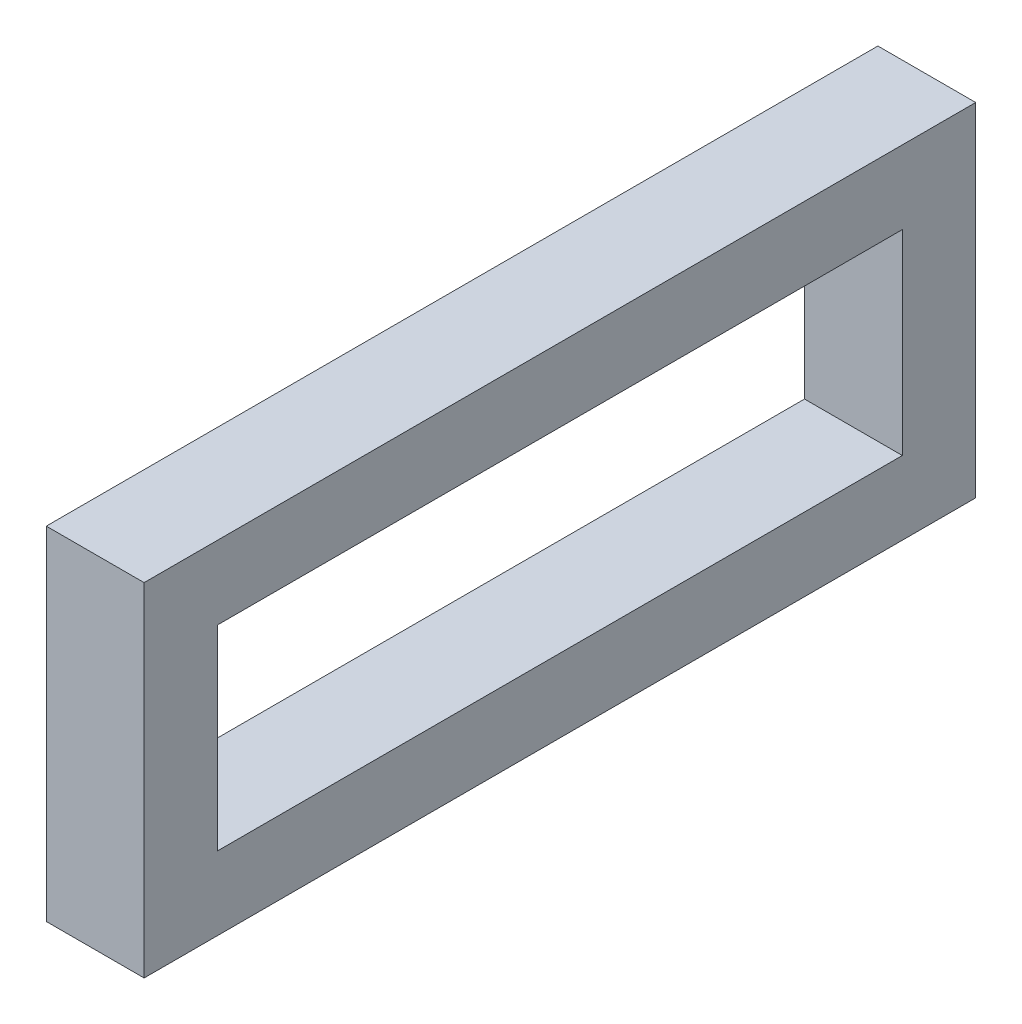
ISO-10303-21;
HEADER;
FILE_DESCRIPTION(('STEP AP214'),'2;1');
FILE_NAME('part.step','',(''),(''),'','','');
FILE_SCHEMA(('AUTOMOTIVE_DESIGN { 1 0 10303 214 1 1 1 1 }'));
ENDSEC;
DATA;
#1=APPLICATION_CONTEXT('core data for automotive mechanical design processes');
#2=APPLICATION_PROTOCOL_DEFINITION('international standard','automotive_design',2000,#1);
#3=PRODUCT_CONTEXT('',#1,'mechanical');
#4=PRODUCT('Part','Part','',(#3));
#5=PRODUCT_RELATED_PRODUCT_CATEGORY('part','',(#4));
#6=PRODUCT_DEFINITION_FORMATION('','',#4);
#7=PRODUCT_DEFINITION_CONTEXT('part definition',#1,'design');
#8=PRODUCT_DEFINITION('design','',#6,#7);
#9=PRODUCT_DEFINITION_SHAPE('','',#8);
#10=(LENGTH_UNIT() NAMED_UNIT(*) SI_UNIT(.MILLI.,.METRE.));
#11=(NAMED_UNIT(*) PLANE_ANGLE_UNIT() SI_UNIT($,.RADIAN.));
#12=(NAMED_UNIT(*) SI_UNIT($,.STERADIAN.) SOLID_ANGLE_UNIT());
#13=UNCERTAINTY_MEASURE_WITH_UNIT(LENGTH_MEASURE(1.E-05),#10,'distance_accuracy_value','');
#14=(GEOMETRIC_REPRESENTATION_CONTEXT(3) GLOBAL_UNCERTAINTY_ASSIGNED_CONTEXT((#13)) GLOBAL_UNIT_ASSIGNED_CONTEXT((#10,
#11,#12)) REPRESENTATION_CONTEXT('',''));
#15=CARTESIAN_POINT('',(0.,0.,0.));
#16=DIRECTION('',(0.,0.,1.));
#17=DIRECTION('',(1.,0.,0.));
#18=AXIS2_PLACEMENT_3D('',#15,#16,#17);
#19=CARTESIAN_POINT('',(20.,0.,0.));
#20=DIRECTION('',(1.,0.,0.));
#21=DIRECTION('',(0.,0.,-1.));
#22=AXIS2_PLACEMENT_3D('',#19,#20,#21);
#23=PLANE('',#22);
#24=DIRECTION('',(0.,1.,0.));
#25=VECTOR('',#24,1.);
#26=CARTESIAN_POINT('',(20.,35.,-85.));
#27=LINE('',#26,#25);
#28=CARTESIAN_POINT('',(20.,-35.,-85.));
#29=VERTEX_POINT('',#28);
#30=CARTESIAN_POINT('',(20.,35.,-85.));
#31=VERTEX_POINT('',#30);
#32=EDGE_CURVE('E153',#29,#31,#27,.T.);
#33=ORIENTED_EDGE('',*,*,#32,.T.);
#34=DIRECTION('',(0.,0.,1.));
#35=VECTOR('',#34,1.);
#36=CARTESIAN_POINT('',(20.,35.,85.));
#37=LINE('',#36,#35);
#38=CARTESIAN_POINT('',(20.,35.,85.));
#39=VERTEX_POINT('',#38);
#40=EDGE_CURVE('E157',#31,#39,#37,.T.);
#41=ORIENTED_EDGE('',*,*,#40,.T.);
#42=DIRECTION('',(0.,-1.,0.));
#43=VECTOR('',#42,1.);
#44=CARTESIAN_POINT('',(20.,35.,85.));
#45=LINE('',#44,#43);
#46=CARTESIAN_POINT('',(20.,-35.,85.));
#47=VERTEX_POINT('',#46);
#48=EDGE_CURVE('E161',#39,#47,#45,.T.);
#49=ORIENTED_EDGE('',*,*,#48,.T.);
#50=DIRECTION('',(0.,0.,-1.));
#51=VECTOR('',#50,1.);
#52=CARTESIAN_POINT('',(20.,-35.,85.));
#53=LINE('',#52,#51);
#54=EDGE_CURVE('E164',#47,#29,#53,.T.);
#55=ORIENTED_EDGE('',*,*,#54,.T.);
#56=EDGE_LOOP('',(#33,#41,#49,#55));
#57=FACE_BOUND('',#56,.T.);
#58=DIRECTION('',(0.,0.,1.));
#59=VECTOR('',#58,1.);
#60=CARTESIAN_POINT('',(20.,20.,70.));
#61=LINE('',#60,#59);
#62=CARTESIAN_POINT('',(20.,20.,-70.));
#63=VERTEX_POINT('',#62);
#64=CARTESIAN_POINT('',(20.,20.,70.));
#65=VERTEX_POINT('',#64);
#66=EDGE_CURVE('E114',#63,#65,#61,.T.);
#67=ORIENTED_EDGE('',*,*,#66,.F.);
#68=DIRECTION('',(0.,1.,0.));
#69=VECTOR('',#68,1.);
#70=CARTESIAN_POINT('',(20.,20.,-70.));
#71=LINE('',#70,#69);
#72=CARTESIAN_POINT('',(20.,-20.,-70.));
#73=VERTEX_POINT('',#72);
#74=EDGE_CURVE('E105',#73,#63,#71,.T.);
#75=ORIENTED_EDGE('',*,*,#74,.F.);
#76=DIRECTION('',(0.,0.,-1.));
#77=VECTOR('',#76,1.);
#78=CARTESIAN_POINT('',(20.,-20.,70.));
#79=LINE('',#78,#77);
#80=CARTESIAN_POINT('',(20.,-20.,70.));
#81=VERTEX_POINT('',#80);
#82=EDGE_CURVE('E131',#81,#73,#79,.T.);
#83=ORIENTED_EDGE('',*,*,#82,.F.);
#84=DIRECTION('',(0.,-1.,0.));
#85=VECTOR('',#84,1.);
#86=CARTESIAN_POINT('',(20.,20.,70.));
#87=LINE('',#86,#85);
#88=EDGE_CURVE('E127',#65,#81,#87,.T.);
#89=ORIENTED_EDGE('',*,*,#88,.F.);
#90=EDGE_LOOP('',(#67,#75,#83,#89));
#91=FACE_BOUND('',#90,.T.);
#92=ADVANCED_FACE('F39',(#57,#91),#23,.T.);
#93=CARTESIAN_POINT('',(0.,0.,0.));
#94=DIRECTION('',(1.,0.,0.));
#95=DIRECTION('',(0.,0.,-1.));
#96=AXIS2_PLACEMENT_3D('',#93,#94,#95);
#97=PLANE('',#96);
#98=DIRECTION('',(0.,1.,0.));
#99=VECTOR('',#98,1.);
#100=CARTESIAN_POINT('',(0.,35.,-85.));
#101=LINE('',#100,#99);
#102=CARTESIAN_POINT('',(0.,-35.,-85.));
#103=VERTEX_POINT('',#102);
#104=CARTESIAN_POINT('',(0.,35.,-85.));
#105=VERTEX_POINT('',#104);
#106=EDGE_CURVE('E123',#103,#105,#101,.T.);
#107=ORIENTED_EDGE('',*,*,#106,.F.);
#108=DIRECTION('',(0.,0.,-1.));
#109=VECTOR('',#108,1.);
#110=CARTESIAN_POINT('',(0.,-35.,85.));
#111=LINE('',#110,#109);
#112=CARTESIAN_POINT('',(0.,-35.,85.));
#113=VERTEX_POINT('',#112);
#114=EDGE_CURVE('E158',#113,#103,#111,.T.);
#115=ORIENTED_EDGE('',*,*,#114,.F.);
#116=DIRECTION('',(0.,-1.,0.));
#117=VECTOR('',#116,1.);
#118=CARTESIAN_POINT('',(0.,35.,85.));
#119=LINE('',#118,#117);
#120=CARTESIAN_POINT('',(0.,35.,85.));
#121=VERTEX_POINT('',#120);
#122=EDGE_CURVE('E174',#121,#113,#119,.T.);
#123=ORIENTED_EDGE('',*,*,#122,.F.);
#124=DIRECTION('',(0.,0.,1.));
#125=VECTOR('',#124,1.);
#126=CARTESIAN_POINT('',(0.,35.,85.));
#127=LINE('',#126,#125);
#128=EDGE_CURVE('E171',#105,#121,#127,.T.);
#129=ORIENTED_EDGE('',*,*,#128,.F.);
#130=EDGE_LOOP('',(#107,#115,#123,#129));
#131=FACE_BOUND('',#130,.T.);
#132=DIRECTION('',(0.,1.,0.));
#133=VECTOR('',#132,1.);
#134=CARTESIAN_POINT('',(0.,20.,-70.));
#135=LINE('',#134,#133);
#136=CARTESIAN_POINT('',(0.,-20.,-70.));
#137=VERTEX_POINT('',#136);
#138=CARTESIAN_POINT('',(0.,20.,-70.));
#139=VERTEX_POINT('',#138);
#140=EDGE_CURVE('E63',#137,#139,#135,.T.);
#141=ORIENTED_EDGE('',*,*,#140,.T.);
#142=DIRECTION('',(0.,0.,1.));
#143=VECTOR('',#142,1.);
#144=CARTESIAN_POINT('',(0.,20.,70.));
#145=LINE('',#144,#143);
#146=CARTESIAN_POINT('',(0.,20.,70.));
#147=VERTEX_POINT('',#146);
#148=EDGE_CURVE('E121',#139,#147,#145,.T.);
#149=ORIENTED_EDGE('',*,*,#148,.T.);
#150=DIRECTION('',(0.,-1.,0.));
#151=VECTOR('',#150,1.);
#152=CARTESIAN_POINT('',(0.,20.,70.));
#153=LINE('',#152,#151);
#154=CARTESIAN_POINT('',(0.,-20.,70.));
#155=VERTEX_POINT('',#154);
#156=EDGE_CURVE('E140',#147,#155,#153,.T.);
#157=ORIENTED_EDGE('',*,*,#156,.T.);
#158=DIRECTION('',(0.,0.,-1.));
#159=VECTOR('',#158,1.);
#160=CARTESIAN_POINT('',(0.,-20.,70.));
#161=LINE('',#160,#159);
#162=EDGE_CURVE('E115',#155,#137,#161,.T.);
#163=ORIENTED_EDGE('',*,*,#162,.T.);
#164=EDGE_LOOP('',(#141,#149,#157,#163));
#165=FACE_BOUND('',#164,.T.);
#166=ADVANCED_FACE('F197',(#131,#165),#97,.F.);
#167=CARTESIAN_POINT('',(20.,35.,-85.));
#168=DIRECTION('',(0.,0.,1.));
#169=DIRECTION('',(1.,0.,0.));
#170=AXIS2_PLACEMENT_3D('',#167,#168,#169);
#171=PLANE('',#170);
#172=ORIENTED_EDGE('',*,*,#106,.T.);
#173=DIRECTION('',(-1.,0.,0.));
#174=VECTOR('',#173,1.);
#175=CARTESIAN_POINT('',(20.,35.,-85.));
#176=LINE('',#175,#174);
#177=EDGE_CURVE('E11',#31,#105,#176,.T.);
#178=ORIENTED_EDGE('',*,*,#177,.F.);
#179=ORIENTED_EDGE('',*,*,#32,.F.);
#180=DIRECTION('',(-1.,0.,0.));
#181=VECTOR('',#180,1.);
#182=CARTESIAN_POINT('',(20.,-35.,-85.));
#183=LINE('',#182,#181);
#184=EDGE_CURVE('E167',#29,#103,#183,.T.);
#185=ORIENTED_EDGE('',*,*,#184,.T.);
#186=EDGE_LOOP('',(#172,#178,#179,#185));
#187=FACE_BOUND('',#186,.T.);
#188=ADVANCED_FACE('F41',(#187),#171,.F.);
#189=CARTESIAN_POINT('',(20.,35.,85.));
#190=DIRECTION('',(0.,-1.,0.));
#191=DIRECTION('',(0.,0.,-1.));
#192=AXIS2_PLACEMENT_3D('',#189,#190,#191);
#193=PLANE('',#192);
#194=ORIENTED_EDGE('',*,*,#128,.T.);
#195=DIRECTION('',(-1.,0.,0.));
#196=VECTOR('',#195,1.);
#197=CARTESIAN_POINT('',(20.,35.,85.));
#198=LINE('',#197,#196);
#199=EDGE_CURVE('E48',#39,#121,#198,.T.);
#200=ORIENTED_EDGE('',*,*,#199,.F.);
#201=ORIENTED_EDGE('',*,*,#40,.F.);
#202=ORIENTED_EDGE('',*,*,#177,.T.);
#203=EDGE_LOOP('',(#194,#200,#201,#202));
#204=FACE_BOUND('',#203,.T.);
#205=ADVANCED_FACE('F207',(#204),#193,.F.);
#206=CARTESIAN_POINT('',(20.,35.,85.));
#207=DIRECTION('',(0.,0.,-1.));
#208=DIRECTION('',(-1.,0.,0.));
#209=AXIS2_PLACEMENT_3D('',#206,#207,#208);
#210=PLANE('',#209);
#211=ORIENTED_EDGE('',*,*,#122,.T.);
#212=DIRECTION('',(-1.,0.,0.));
#213=VECTOR('',#212,1.);
#214=CARTESIAN_POINT('',(20.,-35.,85.));
#215=LINE('',#214,#213);
#216=EDGE_CURVE('E182',#47,#113,#215,.T.);
#217=ORIENTED_EDGE('',*,*,#216,.F.);
#218=ORIENTED_EDGE('',*,*,#48,.F.);
#219=ORIENTED_EDGE('',*,*,#199,.T.);
#220=EDGE_LOOP('',(#211,#217,#218,#219));
#221=FACE_BOUND('',#220,.T.);
#222=ADVANCED_FACE('F191',(#221),#210,.F.);
#223=CARTESIAN_POINT('',(20.,-35.,85.));
#224=DIRECTION('',(0.,1.,0.));
#225=DIRECTION('',(0.,0.,1.));
#226=AXIS2_PLACEMENT_3D('',#223,#224,#225);
#227=PLANE('',#226);
#228=ORIENTED_EDGE('',*,*,#114,.T.);
#229=ORIENTED_EDGE('',*,*,#184,.F.);
#230=ORIENTED_EDGE('',*,*,#54,.F.);
#231=ORIENTED_EDGE('',*,*,#216,.T.);
#232=EDGE_LOOP('',(#228,#229,#230,#231));
#233=FACE_BOUND('',#232,.T.);
#234=ADVANCED_FACE('F201',(#233),#227,.F.);
#235=CARTESIAN_POINT('',(20.,20.,-70.));
#236=DIRECTION('',(0.,0.,1.));
#237=DIRECTION('',(0.,-1.,0.));
#238=AXIS2_PLACEMENT_3D('',#235,#236,#237);
#239=PLANE('',#238);
#240=ORIENTED_EDGE('',*,*,#140,.F.);
#241=DIRECTION('',(-1.,0.,0.));
#242=VECTOR('',#241,1.);
#243=CARTESIAN_POINT('',(20.,-20.,-70.));
#244=LINE('',#243,#242);
#245=EDGE_CURVE('E109',#73,#137,#244,.T.);
#246=ORIENTED_EDGE('',*,*,#245,.F.);
#247=ORIENTED_EDGE('',*,*,#74,.T.);
#248=DIRECTION('',(-1.,0.,0.));
#249=VECTOR('',#248,1.);
#250=CARTESIAN_POINT('',(20.,20.,-70.));
#251=LINE('',#250,#249);
#252=EDGE_CURVE('E108',#63,#139,#251,.T.);
#253=ORIENTED_EDGE('',*,*,#252,.T.);
#254=EDGE_LOOP('',(#240,#246,#247,#253));
#255=FACE_BOUND('',#254,.T.);
#256=ADVANCED_FACE('F107',(#255),#239,.T.);
#257=CARTESIAN_POINT('',(20.,20.,70.));
#258=DIRECTION('',(0.,-1.,0.));
#259=DIRECTION('',(0.,0.,-1.));
#260=AXIS2_PLACEMENT_3D('',#257,#258,#259);
#261=PLANE('',#260);
#262=ORIENTED_EDGE('',*,*,#148,.F.);
#263=ORIENTED_EDGE('',*,*,#252,.F.);
#264=ORIENTED_EDGE('',*,*,#66,.T.);
#265=DIRECTION('',(-1.,0.,0.));
#266=VECTOR('',#265,1.);
#267=CARTESIAN_POINT('',(20.,20.,70.));
#268=LINE('',#267,#266);
#269=EDGE_CURVE('E124',#65,#147,#268,.T.);
#270=ORIENTED_EDGE('',*,*,#269,.T.);
#271=EDGE_LOOP('',(#262,#263,#264,#270));
#272=FACE_BOUND('',#271,.T.);
#273=ADVANCED_FACE('F118',(#272),#261,.T.);
#274=CARTESIAN_POINT('',(20.,20.,70.));
#275=DIRECTION('',(0.,0.,-1.));
#276=DIRECTION('',(-1.,0.,0.));
#277=AXIS2_PLACEMENT_3D('',#274,#275,#276);
#278=PLANE('',#277);
#279=ORIENTED_EDGE('',*,*,#156,.F.);
#280=ORIENTED_EDGE('',*,*,#269,.F.);
#281=ORIENTED_EDGE('',*,*,#88,.T.);
#282=DIRECTION('',(-1.,0.,0.));
#283=VECTOR('',#282,1.);
#284=CARTESIAN_POINT('',(20.,-20.,70.));
#285=LINE('',#284,#283);
#286=EDGE_CURVE('E55',#81,#155,#285,.T.);
#287=ORIENTED_EDGE('',*,*,#286,.T.);
#288=EDGE_LOOP('',(#279,#280,#281,#287));
#289=FACE_BOUND('',#288,.T.);
#290=ADVANCED_FACE('F230',(#289),#278,.T.);
#291=CARTESIAN_POINT('',(20.,-20.,70.));
#292=DIRECTION('',(0.,1.,0.));
#293=DIRECTION('',(0.,0.,1.));
#294=AXIS2_PLACEMENT_3D('',#291,#292,#293);
#295=PLANE('',#294);
#296=ORIENTED_EDGE('',*,*,#162,.F.);
#297=ORIENTED_EDGE('',*,*,#286,.F.);
#298=ORIENTED_EDGE('',*,*,#82,.T.);
#299=ORIENTED_EDGE('',*,*,#245,.T.);
#300=EDGE_LOOP('',(#296,#297,#298,#299));
#301=FACE_BOUND('',#300,.T.);
#302=ADVANCED_FACE('F234',(#301),#295,.T.);
#303=CLOSED_SHELL('',(#92,#166,#188,#205,#222,#234,#256,#273,#290,#302));
#304=MANIFOLD_SOLID_BREP('B2',#303);
#305=ADVANCED_BREP_SHAPE_REPRESENTATION('',(#18,#304),#14);
#306=SHAPE_DEFINITION_REPRESENTATION(#9,#305);
ENDSEC;
END-ISO-10303-21;
